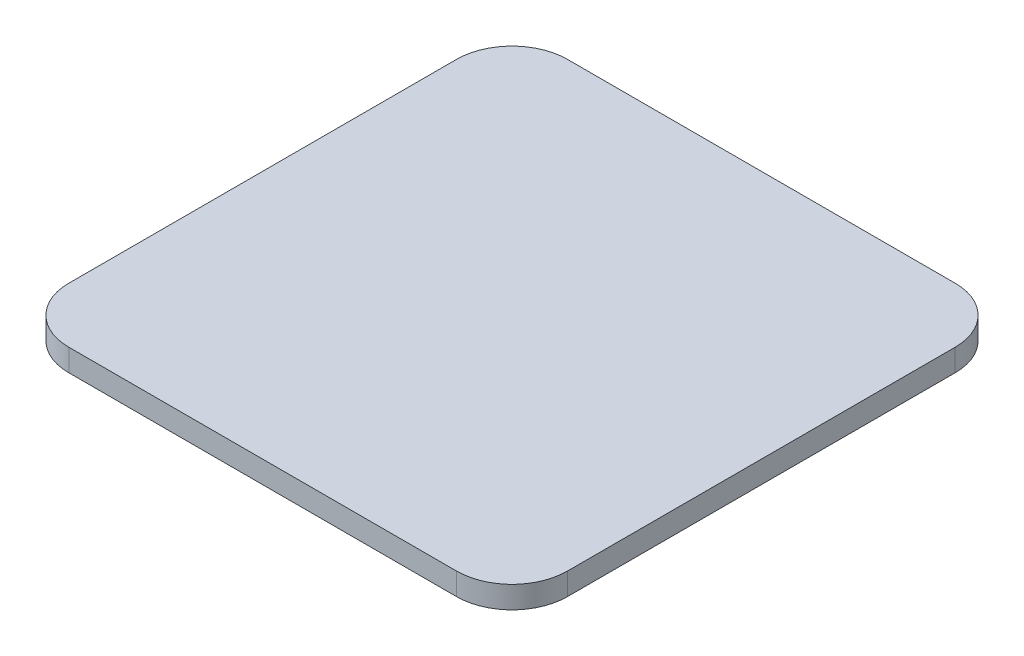
ISO-10303-21;
HEADER;
FILE_DESCRIPTION(('STEP AP214'),'2;1');
FILE_NAME('part.step','',(''),(''),'','','');
FILE_SCHEMA(('AUTOMOTIVE_DESIGN { 1 0 10303 214 1 1 1 1 }'));
ENDSEC;
DATA;
#1=APPLICATION_CONTEXT('core data for automotive mechanical design processes');
#2=APPLICATION_PROTOCOL_DEFINITION('international standard','automotive_design',2000,#1);
#3=PRODUCT_CONTEXT('',#1,'mechanical');
#4=PRODUCT('Part','Part','',(#3));
#5=PRODUCT_RELATED_PRODUCT_CATEGORY('part','',(#4));
#6=PRODUCT_DEFINITION_FORMATION('','',#4);
#7=PRODUCT_DEFINITION_CONTEXT('part definition',#1,'design');
#8=PRODUCT_DEFINITION('design','',#6,#7);
#9=PRODUCT_DEFINITION_SHAPE('','',#8);
#10=(LENGTH_UNIT() NAMED_UNIT(*) SI_UNIT(.MILLI.,.METRE.));
#11=(NAMED_UNIT(*) PLANE_ANGLE_UNIT() SI_UNIT($,.RADIAN.));
#12=(NAMED_UNIT(*) SI_UNIT($,.STERADIAN.) SOLID_ANGLE_UNIT());
#13=UNCERTAINTY_MEASURE_WITH_UNIT(LENGTH_MEASURE(1.E-05),#10,'distance_accuracy_value','');
#14=(GEOMETRIC_REPRESENTATION_CONTEXT(3) GLOBAL_UNCERTAINTY_ASSIGNED_CONTEXT((#13)) GLOBAL_UNIT_ASSIGNED_CONTEXT((#10,
#11,#12)) REPRESENTATION_CONTEXT('',''));
#15=CARTESIAN_POINT('',(0.,0.,0.));
#16=DIRECTION('',(0.,0.,1.));
#17=DIRECTION('',(1.,0.,0.));
#18=AXIS2_PLACEMENT_3D('',#15,#16,#17);
#19=CARTESIAN_POINT('',(10.,4.,-10.));
#20=DIRECTION('',(0.,-1.,0.));
#21=DIRECTION('',(0.,0.,-1.));
#22=AXIS2_PLACEMENT_3D('',#19,#20,#21);
#23=CYLINDRICAL_SURFACE('',#22,10.);
#24=CARTESIAN_POINT('',(10.,0.,-10.));
#25=DIRECTION('',(0.,1.,0.));
#26=DIRECTION('',(0.,0.,1.));
#27=AXIS2_PLACEMENT_3D('',#24,#25,#26);
#28=CIRCLE('',#27,10.);
#29=CARTESIAN_POINT('',(0.,0.,-10.0000000000001));
#30=VERTEX_POINT('',#29);
#31=CARTESIAN_POINT('',(10.0000000000001,0.,0.));
#32=VERTEX_POINT('',#31);
#33=EDGE_CURVE('E128',#30,#32,#28,.T.);
#34=ORIENTED_EDGE('',*,*,#33,.T.);
#35=DIRECTION('',(0.,-1.,0.));
#36=VECTOR('',#35,1.);
#37=CARTESIAN_POINT('',(10.0000000000001,4.,0.));
#38=LINE('',#37,#36);
#39=CARTESIAN_POINT('',(10.0000000000001,4.,0.));
#40=VERTEX_POINT('',#39);
#41=EDGE_CURVE('E11',#40,#32,#38,.T.);
#42=ORIENTED_EDGE('',*,*,#41,.F.);
#43=CARTESIAN_POINT('',(10.,4.,-10.));
#44=DIRECTION('',(0.,1.,0.));
#45=DIRECTION('',(0.,0.,1.));
#46=AXIS2_PLACEMENT_3D('',#43,#44,#45);
#47=CIRCLE('',#46,10.);
#48=CARTESIAN_POINT('',(0.,4.,-10.0000000000001));
#49=VERTEX_POINT('',#48);
#50=EDGE_CURVE('E142',#49,#40,#47,.T.);
#51=ORIENTED_EDGE('',*,*,#50,.F.);
#52=DIRECTION('',(0.,-1.,0.));
#53=VECTOR('',#52,1.);
#54=CARTESIAN_POINT('',(0.,4.,-10.0000000000001));
#55=LINE('',#54,#53);
#56=EDGE_CURVE('E124',#49,#30,#55,.T.);
#57=ORIENTED_EDGE('',*,*,#56,.T.);
#58=EDGE_LOOP('',(#34,#42,#51,#57));
#59=FACE_BOUND('',#58,.T.);
#60=ADVANCED_FACE('F32',(#59),#23,.T.);
#61=CARTESIAN_POINT('',(10.0000000000001,4.,0.));
#62=DIRECTION('',(0.,0.,-1.));
#63=DIRECTION('',(-1.,0.,0.));
#64=AXIS2_PLACEMENT_3D('',#61,#62,#63);
#65=PLANE('',#64);
#66=DIRECTION('',(1.,0.,0.));
#67=VECTOR('',#66,1.);
#68=CARTESIAN_POINT('',(10.0000000000001,0.,0.));
#69=LINE('',#68,#67);
#70=CARTESIAN_POINT('',(79.9999999999999,0.,0.));
#71=VERTEX_POINT('',#70);
#72=EDGE_CURVE('E131',#32,#71,#69,.T.);
#73=ORIENTED_EDGE('',*,*,#72,.T.);
#74=DIRECTION('',(0.,-1.,0.));
#75=VECTOR('',#74,1.);
#76=CARTESIAN_POINT('',(79.9999999999999,4.,0.));
#77=LINE('',#76,#75);
#78=CARTESIAN_POINT('',(79.9999999999999,4.,0.));
#79=VERTEX_POINT('',#78);
#80=EDGE_CURVE('E40',#79,#71,#77,.T.);
#81=ORIENTED_EDGE('',*,*,#80,.F.);
#82=DIRECTION('',(1.,0.,0.));
#83=VECTOR('',#82,1.);
#84=CARTESIAN_POINT('',(10.0000000000001,4.,0.));
#85=LINE('',#84,#83);
#86=EDGE_CURVE('E91',#40,#79,#85,.T.);
#87=ORIENTED_EDGE('',*,*,#86,.F.);
#88=ORIENTED_EDGE('',*,*,#41,.T.);
#89=EDGE_LOOP('',(#73,#81,#87,#88));
#90=FACE_BOUND('',#89,.T.);
#91=ADVANCED_FACE('F177',(#90),#65,.F.);
#92=CARTESIAN_POINT('',(80.,4.,-10.));
#93=DIRECTION('',(0.,-1.,0.));
#94=DIRECTION('',(0.,0.,-1.));
#95=AXIS2_PLACEMENT_3D('',#92,#93,#94);
#96=CYLINDRICAL_SURFACE('',#95,10.);
#97=CARTESIAN_POINT('',(80.,0.,-10.));
#98=DIRECTION('',(0.,1.,0.));
#99=DIRECTION('',(0.,0.,-1.));
#100=AXIS2_PLACEMENT_3D('',#97,#98,#99);
#101=CIRCLE('',#100,10.);
#102=CARTESIAN_POINT('',(90.,0.,-10.0000000000001));
#103=VERTEX_POINT('',#102);
#104=EDGE_CURVE('E133',#71,#103,#101,.T.);
#105=ORIENTED_EDGE('',*,*,#104,.T.);
#106=DIRECTION('',(0.,-1.,0.));
#107=VECTOR('',#106,1.);
#108=CARTESIAN_POINT('',(90.,4.,-10.0000000000001));
#109=LINE('',#108,#107);
#110=CARTESIAN_POINT('',(90.,4.,-10.0000000000001));
#111=VERTEX_POINT('',#110);
#112=EDGE_CURVE('E149',#111,#103,#109,.T.);
#113=ORIENTED_EDGE('',*,*,#112,.F.);
#114=CARTESIAN_POINT('',(80.,4.,-10.));
#115=DIRECTION('',(0.,1.,0.));
#116=DIRECTION('',(0.,0.,-1.));
#117=AXIS2_PLACEMENT_3D('',#114,#115,#116);
#118=CIRCLE('',#117,10.);
#119=EDGE_CURVE('E157',#79,#111,#118,.T.);
#120=ORIENTED_EDGE('',*,*,#119,.F.);
#121=ORIENTED_EDGE('',*,*,#80,.T.);
#122=EDGE_LOOP('',(#105,#113,#120,#121));
#123=FACE_BOUND('',#122,.T.);
#124=ADVANCED_FACE('F155',(#123),#96,.T.);
#125=CARTESIAN_POINT('',(90.,4.,-10.0000000000001));
#126=DIRECTION('',(-1.,0.,0.));
#127=DIRECTION('',(0.,0.,1.));
#128=AXIS2_PLACEMENT_3D('',#125,#126,#127);
#129=PLANE('',#128);
#130=DIRECTION('',(0.,0.,-1.));
#131=VECTOR('',#130,1.);
#132=CARTESIAN_POINT('',(90.,0.,-10.0000000000001));
#133=LINE('',#132,#131);
#134=CARTESIAN_POINT('',(90.,0.,-79.9999999999999));
#135=VERTEX_POINT('',#134);
#136=EDGE_CURVE('E135',#103,#135,#133,.T.);
#137=ORIENTED_EDGE('',*,*,#136,.T.);
#138=DIRECTION('',(0.,-1.,0.));
#139=VECTOR('',#138,1.);
#140=CARTESIAN_POINT('',(90.,4.,-79.9999999999999));
#141=LINE('',#140,#139);
#142=CARTESIAN_POINT('',(90.,4.,-79.9999999999999));
#143=VERTEX_POINT('',#142);
#144=EDGE_CURVE('E146',#143,#135,#141,.T.);
#145=ORIENTED_EDGE('',*,*,#144,.F.);
#146=DIRECTION('',(0.,0.,-1.));
#147=VECTOR('',#146,1.);
#148=CARTESIAN_POINT('',(90.,4.,-10.0000000000001));
#149=LINE('',#148,#147);
#150=EDGE_CURVE('E169',#111,#143,#149,.T.);
#151=ORIENTED_EDGE('',*,*,#150,.F.);
#152=ORIENTED_EDGE('',*,*,#112,.T.);
#153=EDGE_LOOP('',(#137,#145,#151,#152));
#154=FACE_BOUND('',#153,.T.);
#155=ADVANCED_FACE('F165',(#154),#129,.F.);
#156=CARTESIAN_POINT('',(80.,4.,-80.));
#157=DIRECTION('',(0.,-1.,0.));
#158=DIRECTION('',(0.,0.,-1.));
#159=AXIS2_PLACEMENT_3D('',#156,#157,#158);
#160=CYLINDRICAL_SURFACE('',#159,10.);
#161=CARTESIAN_POINT('',(80.,0.,-80.));
#162=DIRECTION('',(0.,1.,0.));
#163=DIRECTION('',(0.,0.,1.));
#164=AXIS2_PLACEMENT_3D('',#161,#162,#163);
#165=CIRCLE('',#164,10.);
#166=CARTESIAN_POINT('',(79.9999999999999,0.,-90.));
#167=VERTEX_POINT('',#166);
#168=EDGE_CURVE('E137',#135,#167,#165,.T.);
#169=ORIENTED_EDGE('',*,*,#168,.T.);
#170=DIRECTION('',(0.,-1.,0.));
#171=VECTOR('',#170,1.);
#172=CARTESIAN_POINT('',(79.9999999999999,4.,-90.));
#173=LINE('',#172,#171);
#174=CARTESIAN_POINT('',(79.9999999999999,4.,-90.));
#175=VERTEX_POINT('',#174);
#176=EDGE_CURVE('E119',#175,#167,#173,.T.);
#177=ORIENTED_EDGE('',*,*,#176,.F.);
#178=CARTESIAN_POINT('',(80.,4.,-80.));
#179=DIRECTION('',(0.,1.,0.));
#180=DIRECTION('',(0.,0.,1.));
#181=AXIS2_PLACEMENT_3D('',#178,#179,#180);
#182=CIRCLE('',#181,10.);
#183=EDGE_CURVE('E110',#143,#175,#182,.T.);
#184=ORIENTED_EDGE('',*,*,#183,.F.);
#185=ORIENTED_EDGE('',*,*,#144,.T.);
#186=EDGE_LOOP('',(#169,#177,#184,#185));
#187=FACE_BOUND('',#186,.T.);
#188=ADVANCED_FACE('F168',(#187),#160,.T.);
#189=CARTESIAN_POINT('',(10.0000000000001,4.,-90.));
#190=DIRECTION('',(0.,0.,1.));
#191=DIRECTION('',(1.,0.,0.));
#192=AXIS2_PLACEMENT_3D('',#189,#190,#191);
#193=PLANE('',#192);
#194=DIRECTION('',(-1.,0.,0.));
#195=VECTOR('',#194,1.);
#196=CARTESIAN_POINT('',(10.0000000000001,0.,-90.));
#197=LINE('',#196,#195);
#198=CARTESIAN_POINT('',(10.0000000000001,0.,-90.));
#199=VERTEX_POINT('',#198);
#200=EDGE_CURVE('E118',#167,#199,#197,.T.);
#201=ORIENTED_EDGE('',*,*,#200,.T.);
#202=DIRECTION('',(0.,-1.,0.));
#203=VECTOR('',#202,1.);
#204=CARTESIAN_POINT('',(10.0000000000001,4.,-90.));
#205=LINE('',#204,#203);
#206=CARTESIAN_POINT('',(10.0000000000001,4.,-90.));
#207=VERTEX_POINT('',#206);
#208=EDGE_CURVE('E115',#207,#199,#205,.T.);
#209=ORIENTED_EDGE('',*,*,#208,.F.);
#210=DIRECTION('',(-1.,0.,0.));
#211=VECTOR('',#210,1.);
#212=CARTESIAN_POINT('',(10.0000000000001,4.,-90.));
#213=LINE('',#212,#211);
#214=EDGE_CURVE('E104',#175,#207,#213,.T.);
#215=ORIENTED_EDGE('',*,*,#214,.F.);
#216=ORIENTED_EDGE('',*,*,#176,.T.);
#217=EDGE_LOOP('',(#201,#209,#215,#216));
#218=FACE_BOUND('',#217,.T.);
#219=ADVANCED_FACE('F116',(#218),#193,.F.);
#220=CARTESIAN_POINT('',(10.,4.,-80.));
#221=DIRECTION('',(0.,-1.,0.));
#222=DIRECTION('',(0.,0.,-1.));
#223=AXIS2_PLACEMENT_3D('',#220,#221,#222);
#224=CYLINDRICAL_SURFACE('',#223,10.);
#225=CARTESIAN_POINT('',(10.,0.,-80.));
#226=DIRECTION('',(0.,1.,0.));
#227=DIRECTION('',(0.,0.,1.));
#228=AXIS2_PLACEMENT_3D('',#225,#226,#227);
#229=CIRCLE('',#228,10.);
#230=CARTESIAN_POINT('',(0.,0.,-79.9999999999999));
#231=VERTEX_POINT('',#230);
#232=EDGE_CURVE('E77',#199,#231,#229,.T.);
#233=ORIENTED_EDGE('',*,*,#232,.T.);
#234=DIRECTION('',(0.,-1.,0.));
#235=VECTOR('',#234,1.);
#236=CARTESIAN_POINT('',(0.,4.,-79.9999999999999));
#237=LINE('',#236,#235);
#238=CARTESIAN_POINT('',(0.,4.,-79.9999999999999));
#239=VERTEX_POINT('',#238);
#240=EDGE_CURVE('E120',#239,#231,#237,.T.);
#241=ORIENTED_EDGE('',*,*,#240,.F.);
#242=CARTESIAN_POINT('',(10.,4.,-80.));
#243=DIRECTION('',(0.,1.,0.));
#244=DIRECTION('',(0.,0.,1.));
#245=AXIS2_PLACEMENT_3D('',#242,#243,#244);
#246=CIRCLE('',#245,10.);
#247=EDGE_CURVE('E108',#207,#239,#246,.T.);
#248=ORIENTED_EDGE('',*,*,#247,.F.);
#249=ORIENTED_EDGE('',*,*,#208,.T.);
#250=EDGE_LOOP('',(#233,#241,#248,#249));
#251=FACE_BOUND('',#250,.T.);
#252=ADVANCED_FACE('F122',(#251),#224,.T.);
#253=CARTESIAN_POINT('',(0.,4.,-10.0000000000001));
#254=DIRECTION('',(1.,0.,0.));
#255=DIRECTION('',(0.,0.,-1.));
#256=AXIS2_PLACEMENT_3D('',#253,#254,#255);
#257=PLANE('',#256);
#258=DIRECTION('',(0.,0.,1.));
#259=VECTOR('',#258,1.);
#260=CARTESIAN_POINT('',(0.,0.,-10.0000000000001));
#261=LINE('',#260,#259);
#262=EDGE_CURVE('E83',#231,#30,#261,.T.);
#263=ORIENTED_EDGE('',*,*,#262,.T.);
#264=ORIENTED_EDGE('',*,*,#56,.F.);
#265=DIRECTION('',(0.,0.,1.));
#266=VECTOR('',#265,1.);
#267=CARTESIAN_POINT('',(0.,4.,-10.0000000000001));
#268=LINE('',#267,#266);
#269=EDGE_CURVE('E48',#239,#49,#268,.T.);
#270=ORIENTED_EDGE('',*,*,#269,.F.);
#271=ORIENTED_EDGE('',*,*,#240,.T.);
#272=EDGE_LOOP('',(#263,#264,#270,#271));
#273=FACE_BOUND('',#272,.T.);
#274=ADVANCED_FACE('F194',(#273),#257,.F.);
#275=CARTESIAN_POINT('',(10.,4.,-10.));
#276=DIRECTION('',(0.,1.,0.));
#277=DIRECTION('',(0.,0.,1.));
#278=AXIS2_PLACEMENT_3D('',#275,#276,#277);
#279=PLANE('',#278);
#280=ORIENTED_EDGE('',*,*,#50,.T.);
#281=ORIENTED_EDGE('',*,*,#86,.T.);
#282=ORIENTED_EDGE('',*,*,#119,.T.);
#283=ORIENTED_EDGE('',*,*,#150,.T.);
#284=ORIENTED_EDGE('',*,*,#183,.T.);
#285=ORIENTED_EDGE('',*,*,#214,.T.);
#286=ORIENTED_EDGE('',*,*,#247,.T.);
#287=ORIENTED_EDGE('',*,*,#269,.T.);
#288=EDGE_LOOP('',(#280,#281,#282,#283,#284,#285,#286,#287));
#289=FACE_BOUND('',#288,.T.);
#290=ADVANCED_FACE('F106',(#289),#279,.T.);
#291=CARTESIAN_POINT('',(10.,0.,-10.));
#292=DIRECTION('',(0.,1.,0.));
#293=DIRECTION('',(0.,0.,1.));
#294=AXIS2_PLACEMENT_3D('',#291,#292,#293);
#295=PLANE('',#294);
#296=ORIENTED_EDGE('',*,*,#33,.F.);
#297=ORIENTED_EDGE('',*,*,#262,.F.);
#298=ORIENTED_EDGE('',*,*,#232,.F.);
#299=ORIENTED_EDGE('',*,*,#200,.F.);
#300=ORIENTED_EDGE('',*,*,#168,.F.);
#301=ORIENTED_EDGE('',*,*,#136,.F.);
#302=ORIENTED_EDGE('',*,*,#104,.F.);
#303=ORIENTED_EDGE('',*,*,#72,.F.);
#304=EDGE_LOOP('',(#296,#297,#298,#299,#300,#301,#302,#303));
#305=FACE_BOUND('',#304,.T.);
#306=ADVANCED_FACE('F161',(#305),#295,.F.);
#307=CLOSED_SHELL('',(#60,#91,#124,#155,#188,#219,#252,#274,#290,#306));
#308=MANIFOLD_SOLID_BREP('B2',#307);
#309=ADVANCED_BREP_SHAPE_REPRESENTATION('',(#18,#308),#14);
#310=SHAPE_DEFINITION_REPRESENTATION(#9,#309);
ENDSEC;
END-ISO-10303-21;
